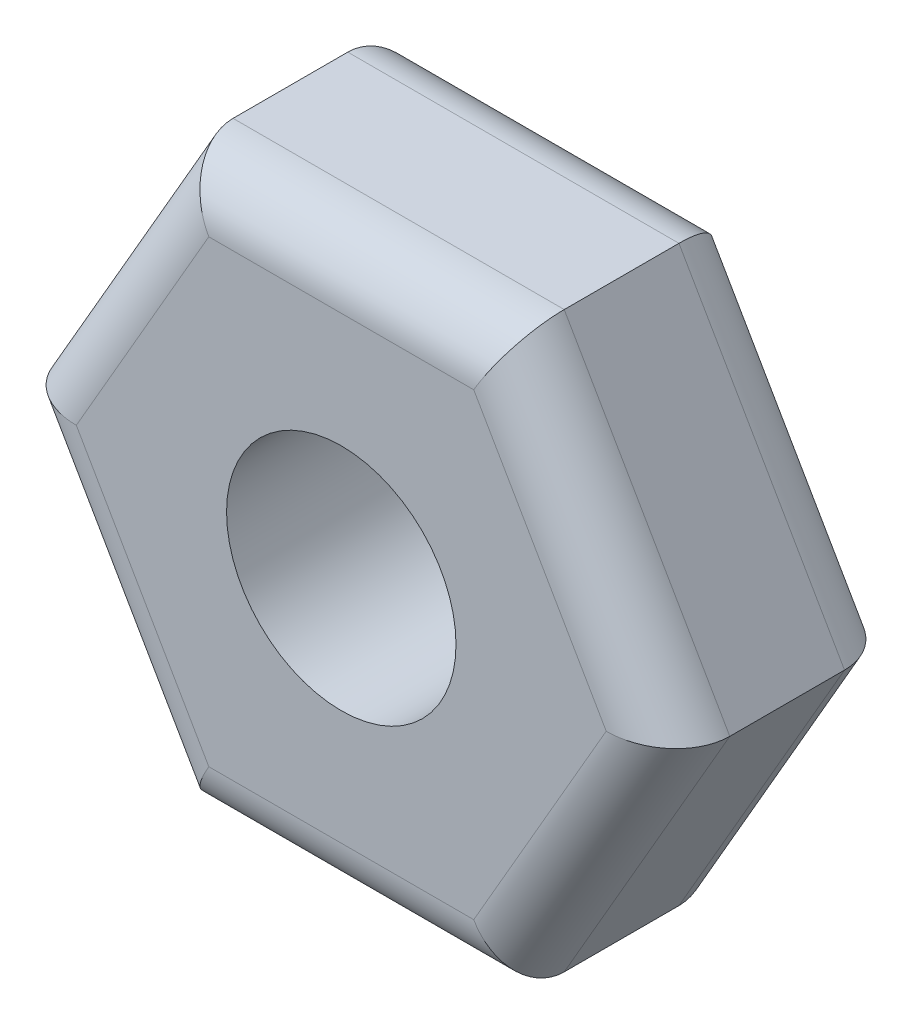
ISO-10303-21;
HEADER;
FILE_DESCRIPTION(('STEP AP214'),'2;1');
FILE_NAME('part.step','',(''),(''),'','','');
FILE_SCHEMA(('AUTOMOTIVE_DESIGN { 1 0 10303 214 1 1 1 1 }'));
ENDSEC;
DATA;
#1=APPLICATION_CONTEXT('core data for automotive mechanical design processes');
#2=APPLICATION_PROTOCOL_DEFINITION('international standard','automotive_design',2000,#1);
#3=PRODUCT_CONTEXT('',#1,'mechanical');
#4=PRODUCT('Part','Part','',(#3));
#5=PRODUCT_RELATED_PRODUCT_CATEGORY('part','',(#4));
#6=PRODUCT_DEFINITION_FORMATION('','',#4);
#7=PRODUCT_DEFINITION_CONTEXT('part definition',#1,'design');
#8=PRODUCT_DEFINITION('design','',#6,#7);
#9=PRODUCT_DEFINITION_SHAPE('','',#8);
#10=(LENGTH_UNIT() NAMED_UNIT(*) SI_UNIT(.MILLI.,.METRE.));
#11=(NAMED_UNIT(*) PLANE_ANGLE_UNIT() SI_UNIT($,.RADIAN.));
#12=(NAMED_UNIT(*) SI_UNIT($,.STERADIAN.) SOLID_ANGLE_UNIT());
#13=UNCERTAINTY_MEASURE_WITH_UNIT(LENGTH_MEASURE(1.E-05),#10,'distance_accuracy_value','');
#14=(GEOMETRIC_REPRESENTATION_CONTEXT(3) GLOBAL_UNCERTAINTY_ASSIGNED_CONTEXT((#13)) GLOBAL_UNIT_ASSIGNED_CONTEXT((#10,
#11,#12)) REPRESENTATION_CONTEXT('',''));
#15=CARTESIAN_POINT('',(0.,0.,0.));
#16=DIRECTION('',(0.,0.,1.));
#17=DIRECTION('',(1.,0.,0.));
#18=AXIS2_PLACEMENT_3D('',#15,#16,#17);
#19=CARTESIAN_POINT('',(0.,0.,4.));
#20=DIRECTION('',(0.,0.,1.));
#21=DIRECTION('',(1.,0.,0.));
#22=AXIS2_PLACEMENT_3D('',#19,#20,#21);
#23=PLANE('',#22);
#24=DIRECTION('',(1.,0.,0.));
#25=VECTOR('',#24,1.);
#26=CARTESIAN_POINT('',(2.88675134594813,-4.,4.));
#27=LINE('',#26,#25);
#28=CARTESIAN_POINT('',(-2.3094010767585,-4.,4.));
#29=VERTEX_POINT('',#28);
#30=CARTESIAN_POINT('',(2.3094010767585,-4.,4.));
#31=VERTEX_POINT('',#30);
#32=EDGE_CURVE('E149',#29,#31,#27,.T.);
#33=ORIENTED_EDGE('',*,*,#32,.T.);
#34=DIRECTION('',(0.5,0.866025403784439,0.));
#35=VECTOR('',#34,1.);
#36=CARTESIAN_POINT('',(4.90747728811182,0.500000000000003,4.));
#37=LINE('',#36,#35);
#38=CARTESIAN_POINT('',(4.61880215351701,0.,4.));
#39=VERTEX_POINT('',#38);
#40=EDGE_CURVE('E130',#31,#39,#37,.T.);
#41=ORIENTED_EDGE('',*,*,#40,.T.);
#42=DIRECTION('',(-0.5,0.866025403784439,0.));
#43=VECTOR('',#42,1.);
#44=CARTESIAN_POINT('',(2.02072594216369,4.5,4.));
#45=LINE('',#44,#43);
#46=CARTESIAN_POINT('',(2.30940107675851,4.,4.));
#47=VERTEX_POINT('',#46);
#48=EDGE_CURVE('E138',#39,#47,#45,.T.);
#49=ORIENTED_EDGE('',*,*,#48,.T.);
#50=DIRECTION('',(-1.,0.,0.));
#51=VECTOR('',#50,1.);
#52=CARTESIAN_POINT('',(-2.88675134594813,4.,4.));
#53=LINE('',#52,#51);
#54=CARTESIAN_POINT('',(-2.3094010767585,4.,4.));
#55=VERTEX_POINT('',#54);
#56=EDGE_CURVE('E144',#47,#55,#53,.T.);
#57=ORIENTED_EDGE('',*,*,#56,.T.);
#58=DIRECTION('',(-0.5,-0.866025403784439,0.));
#59=VECTOR('',#58,1.);
#60=CARTESIAN_POINT('',(-4.90747728811182,-0.5,4.));
#61=LINE('',#60,#59);
#62=CARTESIAN_POINT('',(-4.61880215351701,0.,4.));
#63=VERTEX_POINT('',#62);
#64=EDGE_CURVE('E253',#55,#63,#61,.T.);
#65=ORIENTED_EDGE('',*,*,#64,.T.);
#66=DIRECTION('',(0.5,-0.866025403784439,0.));
#67=VECTOR('',#66,1.);
#68=CARTESIAN_POINT('',(-2.02072594216369,-4.5,4.));
#69=LINE('',#68,#67);
#70=EDGE_CURVE('E154',#63,#29,#69,.T.);
#71=ORIENTED_EDGE('',*,*,#70,.T.);
#72=EDGE_LOOP('',(#33,#41,#49,#57,#65,#71));
#73=FACE_BOUND('',#72,.T.);
#74=CARTESIAN_POINT('',(0.,0.,4.));
#75=DIRECTION('',(0.,0.,1.));
#76=DIRECTION('',(1.,0.,0.));
#77=AXIS2_PLACEMENT_3D('',#74,#75,#76);
#78=CIRCLE('',#77,2.);
#79=CARTESIAN_POINT('',(2.,0.,4.));
#80=VERTEX_POINT('',#79);
#81=EDGE_CURVE('E269',#80,#80,#78,.T.);
#82=ORIENTED_EDGE('',*,*,#81,.F.);
#83=EDGE_LOOP('',(#82));
#84=FACE_BOUND('',#83,.T.);
#85=ADVANCED_FACE('F33',(#73,#84),#23,.T.);
#86=CARTESIAN_POINT('',(0.,0.,0.));
#87=DIRECTION('',(0.,0.,1.));
#88=DIRECTION('',(1.,0.,0.));
#89=AXIS2_PLACEMENT_3D('',#86,#87,#88);
#90=PLANE('',#89);
#91=DIRECTION('',(-0.5,-0.866025403784439,0.));
#92=VECTOR('',#91,1.);
#93=CARTESIAN_POINT('',(-3.46410161513775,2.,0.));
#94=LINE('',#93,#92);
#95=CARTESIAN_POINT('',(-4.61880215351701,0.,0.));
#96=VERTEX_POINT('',#95);
#97=CARTESIAN_POINT('',(-2.3094010767585,4.,0.));
#98=VERTEX_POINT('',#97);
#99=EDGE_CURVE('E190',#96,#98,#94,.F.);
#100=ORIENTED_EDGE('',*,*,#99,.T.);
#101=DIRECTION('',(-1.,0.,0.));
#102=VECTOR('',#101,1.);
#103=CARTESIAN_POINT('',(0.,4.,0.));
#104=LINE('',#103,#102);
#105=CARTESIAN_POINT('',(2.30940107675851,4.,0.));
#106=VERTEX_POINT('',#105);
#107=EDGE_CURVE('E192',#98,#106,#104,.F.);
#108=ORIENTED_EDGE('',*,*,#107,.T.);
#109=DIRECTION('',(-0.5,0.866025403784439,0.));
#110=VECTOR('',#109,1.);
#111=CARTESIAN_POINT('',(3.46410161513776,2.,0.));
#112=LINE('',#111,#110);
#113=CARTESIAN_POINT('',(4.61880215351701,0.,0.));
#114=VERTEX_POINT('',#113);
#115=EDGE_CURVE('E182',#106,#114,#112,.F.);
#116=ORIENTED_EDGE('',*,*,#115,.T.);
#117=DIRECTION('',(0.5,0.866025403784439,0.));
#118=VECTOR('',#117,1.);
#119=CARTESIAN_POINT('',(3.46410161513775,-2.,0.));
#120=LINE('',#119,#118);
#121=CARTESIAN_POINT('',(2.3094010767585,-4.,0.));
#122=VERTEX_POINT('',#121);
#123=EDGE_CURVE('E184',#114,#122,#120,.F.);
#124=ORIENTED_EDGE('',*,*,#123,.T.);
#125=DIRECTION('',(1.,0.,0.));
#126=VECTOR('',#125,1.);
#127=CARTESIAN_POINT('',(0.,-4.,0.));
#128=LINE('',#127,#126);
#129=CARTESIAN_POINT('',(-2.3094010767585,-4.,0.));
#130=VERTEX_POINT('',#129);
#131=EDGE_CURVE('E186',#122,#130,#128,.F.);
#132=ORIENTED_EDGE('',*,*,#131,.T.);
#133=DIRECTION('',(0.5,-0.866025403784439,0.));
#134=VECTOR('',#133,1.);
#135=CARTESIAN_POINT('',(-3.46410161513776,-2.,0.));
#136=LINE('',#135,#134);
#137=EDGE_CURVE('E188',#130,#96,#136,.F.);
#138=ORIENTED_EDGE('',*,*,#137,.T.);
#139=EDGE_LOOP('',(#100,#108,#116,#124,#132,#138));
#140=FACE_BOUND('',#139,.T.);
#141=CARTESIAN_POINT('',(0.,0.,0.));
#142=DIRECTION('',(0.,0.,1.));
#143=DIRECTION('',(1.,0.,0.));
#144=AXIS2_PLACEMENT_3D('',#141,#142,#143);
#145=CIRCLE('',#144,2.);
#146=CARTESIAN_POINT('',(2.,0.,0.));
#147=VERTEX_POINT('',#146);
#148=EDGE_CURVE('E179',#147,#147,#145,.T.);
#149=ORIENTED_EDGE('',*,*,#148,.T.);
#150=EDGE_LOOP('',(#149));
#151=FACE_BOUND('',#150,.T.);
#152=ADVANCED_FACE('F225',(#140,#151),#90,.F.);
#153=CARTESIAN_POINT('',(2.88675134594813,-5.,4.));
#154=DIRECTION('',(-0.866025403784439,0.5,0.));
#155=DIRECTION('',(-0.5,-0.866025403784439,0.));
#156=AXIS2_PLACEMENT_3D('',#153,#154,#155);
#157=PLANE('',#156);
#158=DIRECTION('',(0.,0.,-1.));
#159=VECTOR('',#158,1.);
#160=CARTESIAN_POINT('',(2.88675134594813,-5.,4.));
#161=LINE('',#160,#159);
#162=CARTESIAN_POINT('',(2.88675134594813,-5.,3.));
#163=VERTEX_POINT('',#162);
#164=CARTESIAN_POINT('',(2.88675134594813,-5.,1.));
#165=VERTEX_POINT('',#164);
#166=EDGE_CURVE('E266',#163,#165,#161,.T.);
#167=ORIENTED_EDGE('',*,*,#166,.T.);
#168=DIRECTION('',(0.5,0.866025403784439,0.));
#169=VECTOR('',#168,1.);
#170=CARTESIAN_POINT('',(2.88675134594813,-5.,1.));
#171=LINE('',#170,#169);
#172=CARTESIAN_POINT('',(5.77350269189626,0.,1.));
#173=VERTEX_POINT('',#172);
#174=EDGE_CURVE('E42',#165,#173,#171,.T.);
#175=ORIENTED_EDGE('',*,*,#174,.T.);
#176=DIRECTION('',(0.,0.,-1.));
#177=VECTOR('',#176,1.);
#178=CARTESIAN_POINT('',(5.77350269189626,0.,4.));
#179=LINE('',#178,#177);
#180=CARTESIAN_POINT('',(5.77350269189626,0.,3.));
#181=VERTEX_POINT('',#180);
#182=EDGE_CURVE('E145',#181,#173,#179,.T.);
#183=ORIENTED_EDGE('',*,*,#182,.F.);
#184=DIRECTION('',(0.5,0.866025403784439,0.));
#185=VECTOR('',#184,1.);
#186=CARTESIAN_POINT('',(2.88675134594813,-5.,3.));
#187=LINE('',#186,#185);
#188=EDGE_CURVE('E132',#181,#163,#187,.F.);
#189=ORIENTED_EDGE('',*,*,#188,.T.);
#190=EDGE_LOOP('',(#167,#175,#183,#189));
#191=FACE_BOUND('',#190,.T.);
#192=ADVANCED_FACE('F265',(#191),#157,.F.);
#193=CARTESIAN_POINT('',(5.77350269189626,0.,4.));
#194=DIRECTION('',(-0.866025403784439,-0.5,0.));
#195=DIRECTION('',(0.5,-0.866025403784439,0.));
#196=AXIS2_PLACEMENT_3D('',#193,#194,#195);
#197=PLANE('',#196);
#198=ORIENTED_EDGE('',*,*,#182,.T.);
#199=DIRECTION('',(-0.5,0.866025403784439,0.));
#200=VECTOR('',#199,1.);
#201=CARTESIAN_POINT('',(5.77350269189626,0.,1.));
#202=LINE('',#201,#200);
#203=CARTESIAN_POINT('',(2.88675134594813,5.,1.));
#204=VERTEX_POINT('',#203);
#205=EDGE_CURVE('E11',#173,#204,#202,.T.);
#206=ORIENTED_EDGE('',*,*,#205,.T.);
#207=DIRECTION('',(0.,0.,-1.));
#208=VECTOR('',#207,1.);
#209=CARTESIAN_POINT('',(2.88675134594813,5.,4.));
#210=LINE('',#209,#208);
#211=CARTESIAN_POINT('',(2.88675134594813,5.,3.));
#212=VERTEX_POINT('',#211);
#213=EDGE_CURVE('E239',#212,#204,#210,.T.);
#214=ORIENTED_EDGE('',*,*,#213,.F.);
#215=DIRECTION('',(-0.5,0.866025403784439,0.));
#216=VECTOR('',#215,1.);
#217=CARTESIAN_POINT('',(5.77350269189626,0.,3.));
#218=LINE('',#217,#216);
#219=EDGE_CURVE('E165',#212,#181,#218,.F.);
#220=ORIENTED_EDGE('',*,*,#219,.T.);
#221=EDGE_LOOP('',(#198,#206,#214,#220));
#222=FACE_BOUND('',#221,.T.);
#223=ADVANCED_FACE('F238',(#222),#197,.F.);
#224=CARTESIAN_POINT('',(2.88675134594813,5.,4.));
#225=DIRECTION('',(0.,-1.,0.));
#226=DIRECTION('',(0.,0.,-1.));
#227=AXIS2_PLACEMENT_3D('',#224,#225,#226);
#228=PLANE('',#227);
#229=ORIENTED_EDGE('',*,*,#213,.T.);
#230=DIRECTION('',(-1.,0.,0.));
#231=VECTOR('',#230,1.);
#232=CARTESIAN_POINT('',(2.88675134594813,5.,1.));
#233=LINE('',#232,#231);
#234=CARTESIAN_POINT('',(-2.88675134594813,5.,1.));
#235=VERTEX_POINT('',#234);
#236=EDGE_CURVE('E166',#204,#235,#233,.T.);
#237=ORIENTED_EDGE('',*,*,#236,.T.);
#238=DIRECTION('',(0.,0.,-1.));
#239=VECTOR('',#238,1.);
#240=CARTESIAN_POINT('',(-2.88675134594813,5.,4.));
#241=LINE('',#240,#239);
#242=CARTESIAN_POINT('',(-2.88675134594813,5.,3.));
#243=VERTEX_POINT('',#242);
#244=EDGE_CURVE('E245',#243,#235,#241,.T.);
#245=ORIENTED_EDGE('',*,*,#244,.F.);
#246=DIRECTION('',(-1.,0.,0.));
#247=VECTOR('',#246,1.);
#248=CARTESIAN_POINT('',(2.88675134594813,5.,3.));
#249=LINE('',#248,#247);
#250=EDGE_CURVE('E163',#243,#212,#249,.F.);
#251=ORIENTED_EDGE('',*,*,#250,.T.);
#252=EDGE_LOOP('',(#229,#237,#245,#251));
#253=FACE_BOUND('',#252,.T.);
#254=ADVANCED_FACE('F241',(#253),#228,.F.);
#255=CARTESIAN_POINT('',(-2.88675134594813,5.,4.));
#256=DIRECTION('',(0.866025403784439,-0.5,0.));
#257=DIRECTION('',(0.5,0.866025403784439,0.));
#258=AXIS2_PLACEMENT_3D('',#255,#256,#257);
#259=PLANE('',#258);
#260=ORIENTED_EDGE('',*,*,#244,.T.);
#261=DIRECTION('',(-0.5,-0.866025403784439,0.));
#262=VECTOR('',#261,1.);
#263=CARTESIAN_POINT('',(-2.88675134594813,5.,1.));
#264=LINE('',#263,#262);
#265=CARTESIAN_POINT('',(-5.77350269189626,0.,1.));
#266=VERTEX_POINT('',#265);
#267=EDGE_CURVE('E195',#235,#266,#264,.T.);
#268=ORIENTED_EDGE('',*,*,#267,.T.);
#269=DIRECTION('',(0.,0.,-1.));
#270=VECTOR('',#269,1.);
#271=CARTESIAN_POINT('',(-5.77350269189626,0.,4.));
#272=LINE('',#271,#270);
#273=CARTESIAN_POINT('',(-5.77350269189626,0.,3.));
#274=VERTEX_POINT('',#273);
#275=EDGE_CURVE('E248',#274,#266,#272,.T.);
#276=ORIENTED_EDGE('',*,*,#275,.F.);
#277=DIRECTION('',(-0.5,-0.866025403784439,0.));
#278=VECTOR('',#277,1.);
#279=CARTESIAN_POINT('',(-2.88675134594813,5.,3.));
#280=LINE('',#279,#278);
#281=EDGE_CURVE('E161',#274,#243,#280,.F.);
#282=ORIENTED_EDGE('',*,*,#281,.T.);
#283=EDGE_LOOP('',(#260,#268,#276,#282));
#284=FACE_BOUND('',#283,.T.);
#285=ADVANCED_FACE('F309',(#284),#259,.F.);
#286=CARTESIAN_POINT('',(-5.77350269189626,0.,4.));
#287=DIRECTION('',(0.866025403784439,0.5,0.));
#288=DIRECTION('',(-0.5,0.866025403784439,0.));
#289=AXIS2_PLACEMENT_3D('',#286,#287,#288);
#290=PLANE('',#289);
#291=ORIENTED_EDGE('',*,*,#275,.T.);
#292=DIRECTION('',(0.5,-0.866025403784439,0.));
#293=VECTOR('',#292,1.);
#294=CARTESIAN_POINT('',(-5.77350269189626,0.,1.));
#295=LINE('',#294,#293);
#296=CARTESIAN_POINT('',(-2.88675134594813,-5.,1.));
#297=VERTEX_POINT('',#296);
#298=EDGE_CURVE('E197',#266,#297,#295,.T.);
#299=ORIENTED_EDGE('',*,*,#298,.T.);
#300=DIRECTION('',(0.,0.,-1.));
#301=VECTOR('',#300,1.);
#302=CARTESIAN_POINT('',(-2.88675134594813,-5.,4.));
#303=LINE('',#302,#301);
#304=CARTESIAN_POINT('',(-2.88675134594813,-5.,3.));
#305=VERTEX_POINT('',#304);
#306=EDGE_CURVE('E268',#305,#297,#303,.T.);
#307=ORIENTED_EDGE('',*,*,#306,.F.);
#308=DIRECTION('',(0.5,-0.866025403784439,0.));
#309=VECTOR('',#308,1.);
#310=CARTESIAN_POINT('',(-5.77350269189626,0.,3.));
#311=LINE('',#310,#309);
#312=EDGE_CURVE('E159',#305,#274,#311,.F.);
#313=ORIENTED_EDGE('',*,*,#312,.T.);
#314=EDGE_LOOP('',(#291,#299,#307,#313));
#315=FACE_BOUND('',#314,.T.);
#316=ADVANCED_FACE('F278',(#315),#290,.F.);
#317=CARTESIAN_POINT('',(-2.88675134594813,-5.,4.));
#318=DIRECTION('',(0.,1.,0.));
#319=DIRECTION('',(0.,0.,1.));
#320=AXIS2_PLACEMENT_3D('',#317,#318,#319);
#321=PLANE('',#320);
#322=ORIENTED_EDGE('',*,*,#306,.T.);
#323=DIRECTION('',(1.,0.,0.));
#324=VECTOR('',#323,1.);
#325=CARTESIAN_POINT('',(-2.88675134594813,-5.,1.));
#326=LINE('',#325,#324);
#327=EDGE_CURVE('E57',#297,#165,#326,.T.);
#328=ORIENTED_EDGE('',*,*,#327,.T.);
#329=ORIENTED_EDGE('',*,*,#166,.F.);
#330=DIRECTION('',(1.,0.,0.));
#331=VECTOR('',#330,1.);
#332=CARTESIAN_POINT('',(-2.88675134594813,-5.,3.));
#333=LINE('',#332,#331);
#334=EDGE_CURVE('E152',#163,#305,#333,.F.);
#335=ORIENTED_EDGE('',*,*,#334,.T.);
#336=EDGE_LOOP('',(#322,#328,#329,#335));
#337=FACE_BOUND('',#336,.T.);
#338=ADVANCED_FACE('F267',(#337),#321,.F.);
#339=CARTESIAN_POINT('',(0.,0.,4.));
#340=DIRECTION('',(0.,0.,-1.));
#341=DIRECTION('',(-1.,0.,0.));
#342=AXIS2_PLACEMENT_3D('',#339,#340,#341);
#343=CYLINDRICAL_SURFACE('',#342,2.);
#344=ORIENTED_EDGE('',*,*,#81,.T.);
#345=EDGE_LOOP('',(#344));
#346=FACE_BOUND('',#345,.T.);
#347=ORIENTED_EDGE('',*,*,#148,.F.);
#348=EDGE_LOOP('',(#347));
#349=FACE_BOUND('',#348,.T.);
#350=ADVANCED_FACE('F303',(#346,#349),#343,.F.);
#351=CARTESIAN_POINT('',(-3.46410161513775,2.,3.));
#352=DIRECTION('',(0.5,0.866025403784439,0.));
#353=DIRECTION('',(-0.866025403784439,0.5,0.));
#354=AXIS2_PLACEMENT_3D('',#351,#352,#353);
#355=CYLINDRICAL_SURFACE('',#354,1.);
#356=CARTESIAN_POINT('',(-2.3094010767585,4.,3.));
#357=DIRECTION('',(0.866025403784439,0.5,0.));
#358=DIRECTION('',(0.5,-0.866025403784439,0.));
#359=AXIS2_PLACEMENT_3D('',#356,#357,#358);
#360=ELLIPSE('',#359,1.15470053837925,1.);
#361=EDGE_CURVE('E173',#243,#55,#360,.T.);
#362=ORIENTED_EDGE('',*,*,#361,.F.);
#363=ORIENTED_EDGE('',*,*,#281,.F.);
#364=CARTESIAN_POINT('',(-4.61880215351701,0.,3.));
#365=DIRECTION('',(0.,1.,0.));
#366=DIRECTION('',(1.,0.,0.));
#367=AXIS2_PLACEMENT_3D('',#364,#365,#366);
#368=ELLIPSE('',#367,1.15470053837925,1.);
#369=EDGE_CURVE('E176',#63,#274,#368,.F.);
#370=ORIENTED_EDGE('',*,*,#369,.F.);
#371=ORIENTED_EDGE('',*,*,#64,.F.);
#372=EDGE_LOOP('',(#362,#363,#370,#371));
#373=FACE_BOUND('',#372,.T.);
#374=ADVANCED_FACE('F329',(#373),#355,.T.);
#375=CARTESIAN_POINT('',(-3.46410161513776,-2.,3.));
#376=DIRECTION('',(-0.5,0.866025403784439,0.));
#377=DIRECTION('',(-0.866025403784439,-0.5,0.));
#378=AXIS2_PLACEMENT_3D('',#375,#376,#377);
#379=CYLINDRICAL_SURFACE('',#378,1.);
#380=ORIENTED_EDGE('',*,*,#369,.T.);
#381=ORIENTED_EDGE('',*,*,#312,.F.);
#382=CARTESIAN_POINT('',(-2.3094010767585,-4.,3.));
#383=DIRECTION('',(-0.866025403784439,0.5,0.));
#384=DIRECTION('',(0.5,0.866025403784439,0.));
#385=AXIS2_PLACEMENT_3D('',#382,#383,#384);
#386=ELLIPSE('',#385,1.15470053837925,1.);
#387=EDGE_CURVE('E170',#29,#305,#386,.F.);
#388=ORIENTED_EDGE('',*,*,#387,.F.);
#389=ORIENTED_EDGE('',*,*,#70,.F.);
#390=EDGE_LOOP('',(#380,#381,#388,#389));
#391=FACE_BOUND('',#390,.T.);
#392=ADVANCED_FACE('F260',(#391),#379,.T.);
#393=CARTESIAN_POINT('',(0.,4.,3.));
#394=DIRECTION('',(1.,0.,0.));
#395=DIRECTION('',(0.,0.,-1.));
#396=AXIS2_PLACEMENT_3D('',#393,#394,#395);
#397=CYLINDRICAL_SURFACE('',#396,1.);
#398=ORIENTED_EDGE('',*,*,#361,.T.);
#399=ORIENTED_EDGE('',*,*,#56,.F.);
#400=CARTESIAN_POINT('',(2.30940107675851,4.,3.));
#401=DIRECTION('',(0.866025403784439,-0.5,0.));
#402=DIRECTION('',(-0.5,-0.866025403784439,0.));
#403=AXIS2_PLACEMENT_3D('',#400,#401,#402);
#404=ELLIPSE('',#403,1.15470053837925,1.);
#405=EDGE_CURVE('E141',#212,#47,#404,.T.);
#406=ORIENTED_EDGE('',*,*,#405,.F.);
#407=ORIENTED_EDGE('',*,*,#250,.F.);
#408=EDGE_LOOP('',(#398,#399,#406,#407));
#409=FACE_BOUND('',#408,.T.);
#410=ADVANCED_FACE('F324',(#409),#397,.T.);
#411=CARTESIAN_POINT('',(0.,-4.,3.));
#412=DIRECTION('',(-1.,0.,0.));
#413=DIRECTION('',(0.,0.,1.));
#414=AXIS2_PLACEMENT_3D('',#411,#412,#413);
#415=CYLINDRICAL_SURFACE('',#414,1.);
#416=ORIENTED_EDGE('',*,*,#387,.T.);
#417=ORIENTED_EDGE('',*,*,#334,.F.);
#418=CARTESIAN_POINT('',(2.3094010767585,-4.,3.));
#419=DIRECTION('',(-0.866025403784439,-0.5,0.));
#420=DIRECTION('',(-0.5,0.866025403784439,0.));
#421=AXIS2_PLACEMENT_3D('',#418,#419,#420);
#422=ELLIPSE('',#421,1.15470053837925,1.);
#423=EDGE_CURVE('E135',#31,#163,#422,.F.);
#424=ORIENTED_EDGE('',*,*,#423,.F.);
#425=ORIENTED_EDGE('',*,*,#32,.F.);
#426=EDGE_LOOP('',(#416,#417,#424,#425));
#427=FACE_BOUND('',#426,.T.);
#428=ADVANCED_FACE('F263',(#427),#415,.T.);
#429=CARTESIAN_POINT('',(3.46410161513776,2.,3.));
#430=DIRECTION('',(0.5,-0.866025403784439,0.));
#431=DIRECTION('',(0.866025403784439,0.5,0.));
#432=AXIS2_PLACEMENT_3D('',#429,#430,#431);
#433=CYLINDRICAL_SURFACE('',#432,1.);
#434=ORIENTED_EDGE('',*,*,#405,.T.);
#435=ORIENTED_EDGE('',*,*,#48,.F.);
#436=CARTESIAN_POINT('',(4.61880215351701,0.,3.));
#437=DIRECTION('',(0.,-1.,0.));
#438=DIRECTION('',(1.,0.,0.));
#439=AXIS2_PLACEMENT_3D('',#436,#437,#438);
#440=ELLIPSE('',#439,1.15470053837925,1.);
#441=EDGE_CURVE('E126',#181,#39,#440,.T.);
#442=ORIENTED_EDGE('',*,*,#441,.F.);
#443=ORIENTED_EDGE('',*,*,#219,.F.);
#444=EDGE_LOOP('',(#434,#435,#442,#443));
#445=FACE_BOUND('',#444,.T.);
#446=ADVANCED_FACE('F139',(#445),#433,.T.);
#447=CARTESIAN_POINT('',(3.46410161513775,-2.,3.));
#448=DIRECTION('',(-0.5,-0.866025403784439,0.));
#449=DIRECTION('',(0.866025403784439,-0.5,0.));
#450=AXIS2_PLACEMENT_3D('',#447,#448,#449);
#451=CYLINDRICAL_SURFACE('',#450,1.);
#452=ORIENTED_EDGE('',*,*,#423,.T.);
#453=ORIENTED_EDGE('',*,*,#188,.F.);
#454=ORIENTED_EDGE('',*,*,#441,.T.);
#455=ORIENTED_EDGE('',*,*,#40,.F.);
#456=EDGE_LOOP('',(#452,#453,#454,#455));
#457=FACE_BOUND('',#456,.T.);
#458=ADVANCED_FACE('F128',(#457),#451,.T.);
#459=CARTESIAN_POINT('',(-2.88675134594813,-4.,1.));
#460=DIRECTION('',(1.,0.,0.));
#461=DIRECTION('',(0.,0.,-1.));
#462=AXIS2_PLACEMENT_3D('',#459,#460,#461);
#463=CYLINDRICAL_SURFACE('',#462,1.);
#464=CARTESIAN_POINT('',(-2.3094010767585,-4.,1.));
#465=DIRECTION('',(0.866025403784439,-0.5,0.));
#466=DIRECTION('',(0.5,0.866025403784439,0.));
#467=AXIS2_PLACEMENT_3D('',#464,#465,#466);
#468=ELLIPSE('',#467,1.15470053837925,1.);
#469=EDGE_CURVE('E210',#130,#297,#468,.F.);
#470=ORIENTED_EDGE('',*,*,#469,.F.);
#471=ORIENTED_EDGE('',*,*,#131,.F.);
#472=CARTESIAN_POINT('',(2.3094010767585,-4.,1.));
#473=DIRECTION('',(0.866025403784439,0.5,0.));
#474=DIRECTION('',(-0.5,0.866025403784439,0.));
#475=AXIS2_PLACEMENT_3D('',#472,#473,#474);
#476=ELLIPSE('',#475,1.15470053837925,1.);
#477=EDGE_CURVE('E37',#165,#122,#476,.T.);
#478=ORIENTED_EDGE('',*,*,#477,.F.);
#479=ORIENTED_EDGE('',*,*,#327,.F.);
#480=EDGE_LOOP('',(#470,#471,#478,#479));
#481=FACE_BOUND('',#480,.T.);
#482=ADVANCED_FACE('F35',(#481),#463,.T.);
#483=CARTESIAN_POINT('',(2.02072594216369,-4.5,1.));
#484=DIRECTION('',(0.5,0.866025403784439,0.));
#485=DIRECTION('',(-0.866025403784439,0.5,0.));
#486=AXIS2_PLACEMENT_3D('',#483,#484,#485);
#487=CYLINDRICAL_SURFACE('',#486,1.);
#488=ORIENTED_EDGE('',*,*,#477,.T.);
#489=ORIENTED_EDGE('',*,*,#123,.F.);
#490=CARTESIAN_POINT('',(4.61880215351701,0.,1.));
#491=DIRECTION('',(0.,1.,0.));
#492=DIRECTION('',(-1.,0.,0.));
#493=AXIS2_PLACEMENT_3D('',#490,#491,#492);
#494=ELLIPSE('',#493,1.15470053837925,1.);
#495=EDGE_CURVE('E208',#173,#114,#494,.T.);
#496=ORIENTED_EDGE('',*,*,#495,.F.);
#497=ORIENTED_EDGE('',*,*,#174,.F.);
#498=EDGE_LOOP('',(#488,#489,#496,#497));
#499=FACE_BOUND('',#498,.T.);
#500=ADVANCED_FACE('F220',(#499),#487,.T.);
#501=CARTESIAN_POINT('',(-4.90747728811182,0.5,1.));
#502=DIRECTION('',(0.5,-0.866025403784439,0.));
#503=DIRECTION('',(0.866025403784439,0.5,0.));
#504=AXIS2_PLACEMENT_3D('',#501,#502,#503);
#505=CYLINDRICAL_SURFACE('',#504,1.);
#506=ORIENTED_EDGE('',*,*,#469,.T.);
#507=ORIENTED_EDGE('',*,*,#298,.F.);
#508=CARTESIAN_POINT('',(-4.618802153517,0.,1.));
#509=DIRECTION('',(0.,-1.,0.));
#510=DIRECTION('',(1.,0.,0.));
#511=AXIS2_PLACEMENT_3D('',#508,#509,#510);
#512=ELLIPSE('',#511,1.15470053837925,1.);
#513=EDGE_CURVE('E205',#96,#266,#512,.F.);
#514=ORIENTED_EDGE('',*,*,#513,.F.);
#515=ORIENTED_EDGE('',*,*,#137,.F.);
#516=EDGE_LOOP('',(#506,#507,#514,#515));
#517=FACE_BOUND('',#516,.T.);
#518=ADVANCED_FACE('F281',(#517),#505,.T.);
#519=CARTESIAN_POINT('',(4.90747728811182,-0.499999999999997,1.));
#520=DIRECTION('',(-0.5,0.866025403784439,0.));
#521=DIRECTION('',(-0.866025403784439,-0.5,0.));
#522=AXIS2_PLACEMENT_3D('',#519,#520,#521);
#523=CYLINDRICAL_SURFACE('',#522,1.);
#524=ORIENTED_EDGE('',*,*,#495,.T.);
#525=ORIENTED_EDGE('',*,*,#115,.F.);
#526=CARTESIAN_POINT('',(2.30940107675851,4.,1.));
#527=DIRECTION('',(-0.866025403784439,0.5,0.));
#528=DIRECTION('',(0.5,0.866025403784439,0.));
#529=AXIS2_PLACEMENT_3D('',#526,#527,#528);
#530=ELLIPSE('',#529,1.15470053837925,1.);
#531=EDGE_CURVE('E203',#204,#106,#530,.T.);
#532=ORIENTED_EDGE('',*,*,#531,.F.);
#533=ORIENTED_EDGE('',*,*,#205,.F.);
#534=EDGE_LOOP('',(#524,#525,#532,#533));
#535=FACE_BOUND('',#534,.T.);
#536=ADVANCED_FACE('F232',(#535),#523,.T.);
#537=CARTESIAN_POINT('',(-2.02072594216369,4.5,1.));
#538=DIRECTION('',(-0.5,-0.866025403784439,0.));
#539=DIRECTION('',(0.866025403784439,-0.5,0.));
#540=AXIS2_PLACEMENT_3D('',#537,#538,#539);
#541=CYLINDRICAL_SURFACE('',#540,1.);
#542=ORIENTED_EDGE('',*,*,#513,.T.);
#543=ORIENTED_EDGE('',*,*,#267,.F.);
#544=CARTESIAN_POINT('',(-2.3094010767585,4.,1.));
#545=DIRECTION('',(-0.866025403784439,-0.5,0.));
#546=DIRECTION('',(0.5,-0.866025403784439,0.));
#547=AXIS2_PLACEMENT_3D('',#544,#545,#546);
#548=ELLIPSE('',#547,1.15470053837925,1.);
#549=EDGE_CURVE('E201',#98,#235,#548,.F.);
#550=ORIENTED_EDGE('',*,*,#549,.F.);
#551=ORIENTED_EDGE('',*,*,#99,.F.);
#552=EDGE_LOOP('',(#542,#543,#550,#551));
#553=FACE_BOUND('',#552,.T.);
#554=ADVANCED_FACE('F285',(#553),#541,.T.);
#555=CARTESIAN_POINT('',(2.88675134594813,4.,1.));
#556=DIRECTION('',(-1.,0.,0.));
#557=DIRECTION('',(0.,0.,1.));
#558=AXIS2_PLACEMENT_3D('',#555,#556,#557);
#559=CYLINDRICAL_SURFACE('',#558,1.);
#560=ORIENTED_EDGE('',*,*,#531,.T.);
#561=ORIENTED_EDGE('',*,*,#107,.F.);
#562=ORIENTED_EDGE('',*,*,#549,.T.);
#563=ORIENTED_EDGE('',*,*,#236,.F.);
#564=EDGE_LOOP('',(#560,#561,#562,#563));
#565=FACE_BOUND('',#564,.T.);
#566=ADVANCED_FACE('F288',(#565),#559,.T.);
#567=CLOSED_SHELL('',(#85,#152,#192,#223,#254,#285,#316,#338,#350,#374,#392,#410,#428,#446,#458,
#482,#500,#518,#536,#554,#566));
#568=MANIFOLD_SOLID_BREP('B2',#567);
#569=ADVANCED_BREP_SHAPE_REPRESENTATION('',(#18,#568),#14);
#570=SHAPE_DEFINITION_REPRESENTATION(#9,#569);
ENDSEC;
END-ISO-10303-21;
